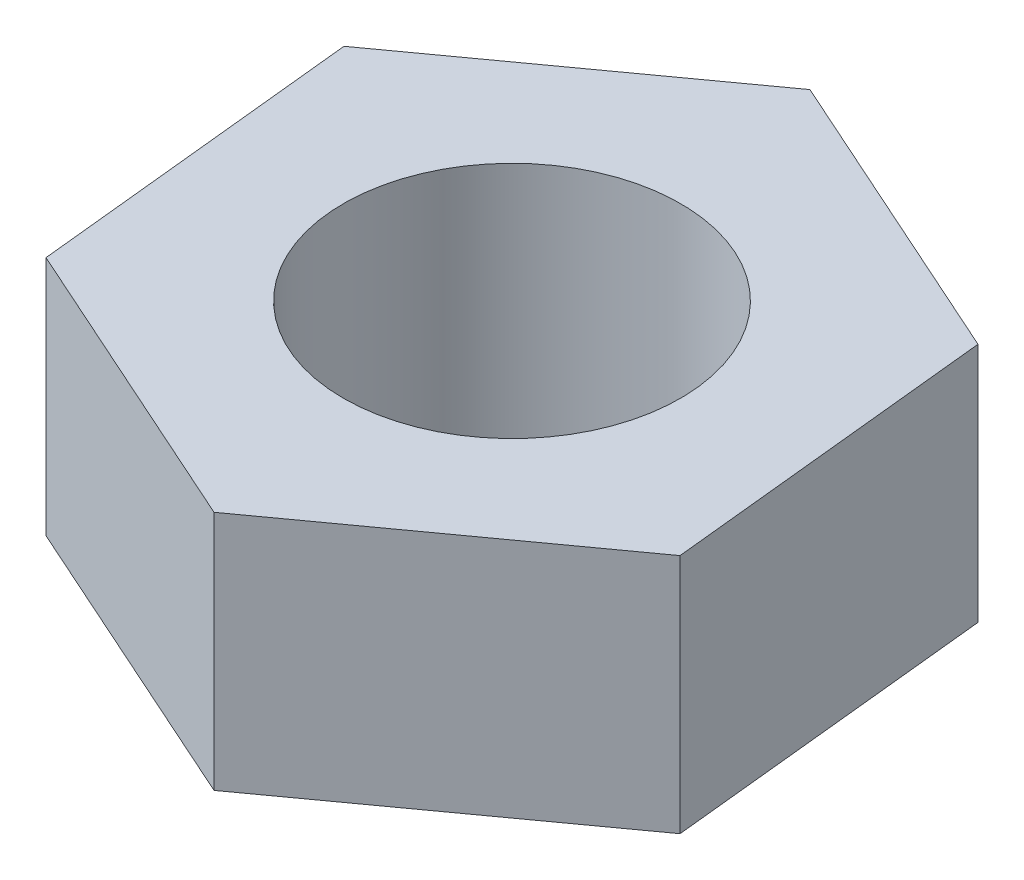
ISO-10303-21;
HEADER;
FILE_DESCRIPTION(('STEP AP214'),'2;1');
FILE_NAME('part.step','',(''),(''),'','','');
FILE_SCHEMA(('AUTOMOTIVE_DESIGN { 1 0 10303 214 1 1 1 1 }'));
ENDSEC;
DATA;
#1=APPLICATION_CONTEXT('core data for automotive mechanical design processes');
#2=APPLICATION_PROTOCOL_DEFINITION('international standard','automotive_design',2000,#1);
#3=PRODUCT_CONTEXT('',#1,'mechanical');
#4=PRODUCT('Part','Part','',(#3));
#5=PRODUCT_RELATED_PRODUCT_CATEGORY('part','',(#4));
#6=PRODUCT_DEFINITION_FORMATION('','',#4);
#7=PRODUCT_DEFINITION_CONTEXT('part definition',#1,'design');
#8=PRODUCT_DEFINITION('design','',#6,#7);
#9=PRODUCT_DEFINITION_SHAPE('','',#8);
#10=(LENGTH_UNIT() NAMED_UNIT(*) SI_UNIT(.MILLI.,.METRE.));
#11=(NAMED_UNIT(*) PLANE_ANGLE_UNIT() SI_UNIT($,.RADIAN.));
#12=(NAMED_UNIT(*) SI_UNIT($,.STERADIAN.) SOLID_ANGLE_UNIT());
#13=UNCERTAINTY_MEASURE_WITH_UNIT(LENGTH_MEASURE(1.E-05),#10,'distance_accuracy_value','');
#14=(GEOMETRIC_REPRESENTATION_CONTEXT(3) GLOBAL_UNCERTAINTY_ASSIGNED_CONTEXT((#13)) GLOBAL_UNIT_ASSIGNED_CONTEXT((#10,
#11,#12)) REPRESENTATION_CONTEXT('',''));
#15=CARTESIAN_POINT('',(0.,0.,0.));
#16=DIRECTION('',(0.,0.,1.));
#17=DIRECTION('',(1.,0.,0.));
#18=AXIS2_PLACEMENT_3D('',#15,#16,#17);
#19=CARTESIAN_POINT('',(7.21644966006352E-13,10.,2.46330733588707E-12));
#20=DIRECTION('',(0.,1.,0.));
#21=DIRECTION('',(0.,0.,1.00000000000003));
#22=AXIS2_PLACEMENT_3D('',#19,#20,#21);
#23=PLANE('',#22);
#24=DIRECTION('',(-0.102025444014476,0.,-0.994781789526572));
#25=VECTOR('',#24,1.);
#26=CARTESIAN_POINT('',(12.6442344851103,9.99999999999962,5.66774507944609));
#27=LINE('',#26,#25);
#28=CARTESIAN_POINT('',(12.6442344851103,9.99999999999962,5.66774507944609));
#29=VERTEX_POINT('',#28);
#30=CARTESIAN_POINT('',(11.2305284635279,9.99999999999959,-8.11635573578706));
#31=VERTEX_POINT('',#30);
#32=EDGE_CURVE('E144',#29,#31,#27,.T.);
#33=ORIENTED_EDGE('',*,*,#32,.T.);
#34=DIRECTION('',(-0.912519022959389,0.,-0.409034268414365));
#35=VECTOR('',#34,1.);
#36=CARTESIAN_POINT('',(11.2305284635279,9.99999999999959,-8.11635573578706));
#37=LINE('',#36,#35);
#38=CARTESIAN_POINT('',(-1.41370602158297,10.0000000000001,-13.7841008152311));
#39=VERTEX_POINT('',#38);
#40=EDGE_CURVE('E91',#31,#39,#37,.T.);
#41=ORIENTED_EDGE('',*,*,#40,.T.);
#42=DIRECTION('',(-0.810493578944917,0.,0.585747521112208));
#43=VECTOR('',#42,1.);
#44=CARTESIAN_POINT('',(-1.41370602158297,10.0000000000001,-13.7841008152311));
#45=LINE('',#44,#43);
#46=CARTESIAN_POINT('',(-12.6442344851105,9.99999999999916,-5.66774507944047));
#47=VERTEX_POINT('',#46);
#48=EDGE_CURVE('E104',#39,#47,#45,.T.);
#49=ORIENTED_EDGE('',*,*,#48,.T.);
#50=DIRECTION('',(0.102025444014476,0.,0.994781789526572));
#51=VECTOR('',#50,1.);
#52=CARTESIAN_POINT('',(-12.6442344851105,9.99999999999916,-5.66774507944047));
#53=LINE('',#52,#51);
#54=CARTESIAN_POINT('',(-11.230528463527,9.99999999999917,8.11635573579379));
#55=VERTEX_POINT('',#54);
#56=EDGE_CURVE('E98',#47,#55,#53,.T.);
#57=ORIENTED_EDGE('',*,*,#56,.T.);
#58=DIRECTION('',(0.912519022959389,0.,0.409034268414365));
#59=VECTOR('',#58,1.);
#60=CARTESIAN_POINT('',(-11.230528463527,9.99999999999917,8.11635573579379));
#61=LINE('',#60,#59);
#62=CARTESIAN_POINT('',(1.41370602158297,10.,13.7841008152369));
#63=VERTEX_POINT('',#62);
#64=EDGE_CURVE('E102',#55,#63,#61,.T.);
#65=ORIENTED_EDGE('',*,*,#64,.T.);
#66=DIRECTION('',(0.810493578944917,0.,-0.585747521112208));
#67=VECTOR('',#66,1.);
#68=CARTESIAN_POINT('',(1.41370602158297,10.,13.7841008152369));
#69=LINE('',#68,#67);
#70=EDGE_CURVE('E54',#63,#29,#69,.T.);
#71=ORIENTED_EDGE('',*,*,#70,.T.);
#72=EDGE_LOOP('',(#33,#41,#49,#57,#65,#71));
#73=FACE_BOUND('',#72,.T.);
#74=CARTESIAN_POINT('',(7.21644966006352E-13,10.,2.46330733588707E-12));
#75=DIRECTION('',(0.,1.,0.));
#76=DIRECTION('',(0.,0.,1.00000000000003));
#77=AXIS2_PLACEMENT_3D('',#74,#75,#76);
#78=CIRCLE('',#77,7.);
#79=CARTESIAN_POINT('',(7.19944936999894E-13,10.,7.00000000000265));
#80=VERTEX_POINT('',#79);
#81=EDGE_CURVE('E132',#80,#80,#78,.T.);
#82=ORIENTED_EDGE('',*,*,#81,.F.);
#83=EDGE_LOOP('',(#82));
#84=FACE_BOUND('',#83,.T.);
#85=ADVANCED_FACE('F36',(#73,#84),#23,.T.);
#86=CARTESIAN_POINT('',(0.,0.,0.));
#87=DIRECTION('',(0.,1.,0.));
#88=DIRECTION('',(0.,0.,1.00000000000003));
#89=AXIS2_PLACEMENT_3D('',#86,#87,#88);
#90=PLANE('',#89);
#91=DIRECTION('',(-0.102025444014476,0.,-0.994781789526572));
#92=VECTOR('',#91,1.);
#93=CARTESIAN_POINT('',(12.6442344851104,-4.37150315946155E-13,5.66774507944653));
#94=LINE('',#93,#92);
#95=CARTESIAN_POINT('',(12.6442344851104,-4.37150315946155E-13,5.66774507944653));
#96=VERTEX_POINT('',#95);
#97=CARTESIAN_POINT('',(11.2305284635275,-4.44089209850063E-13,-8.11635573578863));
#98=VERTEX_POINT('',#97);
#99=EDGE_CURVE('E127',#96,#98,#94,.T.);
#100=ORIENTED_EDGE('',*,*,#99,.F.);
#101=DIRECTION('',(0.810493578944917,0.,-0.585747521112208));
#102=VECTOR('',#101,1.);
#103=CARTESIAN_POINT('',(1.41370602158258,-2.18575157973078E-13,13.7841008152369));
#104=LINE('',#103,#102);
#105=CARTESIAN_POINT('',(1.41370602158258,-2.18575157973078E-13,13.7841008152369));
#106=VERTEX_POINT('',#105);
#107=EDGE_CURVE('E83',#106,#96,#104,.T.);
#108=ORIENTED_EDGE('',*,*,#107,.F.);
#109=DIRECTION('',(0.912519022959389,0.,0.409034268414365));
#110=VECTOR('',#109,1.);
#111=CARTESIAN_POINT('',(-11.2305284635281,-8.74300631892311E-13,8.11635573579422));
#112=LINE('',#111,#110);
#113=CARTESIAN_POINT('',(-11.2305284635281,-8.74300631892311E-13,8.11635573579422));
#114=VERTEX_POINT('',#113);
#115=EDGE_CURVE('E77',#114,#106,#112,.T.);
#116=ORIENTED_EDGE('',*,*,#115,.F.);
#117=DIRECTION('',(0.102025444014476,0.,0.994781789526572));
#118=VECTOR('',#117,1.);
#119=CARTESIAN_POINT('',(-12.6442344851108,-8.84708972748172E-13,-5.66774507944177));
#120=LINE('',#119,#118);
#121=CARTESIAN_POINT('',(-12.6442344851108,-8.84708972748172E-13,-5.66774507944177));
#122=VERTEX_POINT('',#121);
#123=EDGE_CURVE('E113',#122,#114,#120,.T.);
#124=ORIENTED_EDGE('',*,*,#123,.F.);
#125=DIRECTION('',(-0.810493578944917,0.,0.585747521112208));
#126=VECTOR('',#125,1.);
#127=CARTESIAN_POINT('',(-1.41370602158392,0.,-13.7841008152322));
#128=LINE('',#127,#126);
#129=CARTESIAN_POINT('',(-1.41370602158392,0.,-13.7841008152322));
#130=VERTEX_POINT('',#129);
#131=EDGE_CURVE('E135',#130,#122,#128,.T.);
#132=ORIENTED_EDGE('',*,*,#131,.F.);
#133=DIRECTION('',(-0.912519022959389,0.,-0.409034268414365));
#134=VECTOR('',#133,1.);
#135=CARTESIAN_POINT('',(11.2305284635275,-4.44089209850063E-13,-8.11635573578863));
#136=LINE('',#135,#134);
#137=EDGE_CURVE('E131',#98,#130,#136,.T.);
#138=ORIENTED_EDGE('',*,*,#137,.F.);
#139=EDGE_LOOP('',(#100,#108,#116,#124,#132,#138));
#140=FACE_BOUND('',#139,.T.);
#141=CARTESIAN_POINT('',(0.,0.,0.));
#142=DIRECTION('',(0.,1.,0.));
#143=DIRECTION('',(0.,0.,1.00000000000003));
#144=AXIS2_PLACEMENT_3D('',#141,#142,#143);
#145=CIRCLE('',#144,7.);
#146=CARTESIAN_POINT('',(0.,0.,7.00000000000019));
#147=VERTEX_POINT('',#146);
#148=EDGE_CURVE('E260',#147,#147,#145,.T.);
#149=ORIENTED_EDGE('',*,*,#148,.T.);
#150=EDGE_LOOP('',(#149));
#151=FACE_BOUND('',#150,.T.);
#152=ADVANCED_FACE('F158',(#140,#151),#90,.F.);
#153=CARTESIAN_POINT('',(12.6442344851103,9.99999999999962,5.66774507944609));
#154=DIRECTION('',(-0.994781789526569,0.,0.102025444014475));
#155=DIRECTION('',(0.102025444014475,0.,0.994781789526572));
#156=AXIS2_PLACEMENT_3D('',#153,#154,#155);
#157=PLANE('',#156);
#158=ORIENTED_EDGE('',*,*,#99,.T.);
#159=DIRECTION('',(0.,-1.,0.));
#160=VECTOR('',#159,1.);
#161=CARTESIAN_POINT('',(11.2305284635279,9.99999999999959,-8.11635573578706));
#162=LINE('',#161,#160);
#163=EDGE_CURVE('E11',#31,#98,#162,.T.);
#164=ORIENTED_EDGE('',*,*,#163,.F.);
#165=ORIENTED_EDGE('',*,*,#32,.F.);
#166=DIRECTION('',(0.,-1.,0.));
#167=VECTOR('',#166,1.);
#168=CARTESIAN_POINT('',(12.6442344851103,9.99999999999962,5.66774507944609));
#169=LINE('',#168,#167);
#170=EDGE_CURVE('E123',#29,#96,#169,.T.);
#171=ORIENTED_EDGE('',*,*,#170,.T.);
#172=EDGE_LOOP('',(#158,#164,#165,#171));
#173=FACE_BOUND('',#172,.T.);
#174=ADVANCED_FACE('F38',(#173),#157,.F.);
#175=CARTESIAN_POINT('',(11.2305284635279,9.99999999999959,-8.11635573578706));
#176=DIRECTION('',(-0.409034268414364,0.,0.912519022959391));
#177=DIRECTION('',(0.912519022959389,0.,0.409034268414365));
#178=AXIS2_PLACEMENT_3D('',#175,#176,#177);
#179=PLANE('',#178);
#180=ORIENTED_EDGE('',*,*,#137,.T.);
#181=DIRECTION('',(0.,-1.,0.));
#182=VECTOR('',#181,1.);
#183=CARTESIAN_POINT('',(-1.41370602158297,10.0000000000001,-13.7841008152311));
#184=LINE('',#183,#182);
#185=EDGE_CURVE('E46',#39,#130,#184,.T.);
#186=ORIENTED_EDGE('',*,*,#185,.F.);
#187=ORIENTED_EDGE('',*,*,#40,.F.);
#188=ORIENTED_EDGE('',*,*,#163,.T.);
#189=EDGE_LOOP('',(#180,#186,#187,#188));
#190=FACE_BOUND('',#189,.T.);
#191=ADVANCED_FACE('F183',(#190),#179,.F.);
#192=CARTESIAN_POINT('',(-1.41370602158297,10.0000000000001,-13.7841008152311));
#193=DIRECTION('',(0.585747521112209,0.,0.81049357894492));
#194=DIRECTION('',(0.810493578944917,0.,-0.585747521112208));
#195=AXIS2_PLACEMENT_3D('',#192,#193,#194);
#196=PLANE('',#195);
#197=ORIENTED_EDGE('',*,*,#131,.T.);
#198=DIRECTION('',(0.,-1.,0.));
#199=VECTOR('',#198,1.);
#200=CARTESIAN_POINT('',(-12.6442344851105,9.99999999999916,-5.66774507944047));
#201=LINE('',#200,#199);
#202=EDGE_CURVE('E115',#47,#122,#201,.T.);
#203=ORIENTED_EDGE('',*,*,#202,.F.);
#204=ORIENTED_EDGE('',*,*,#48,.F.);
#205=ORIENTED_EDGE('',*,*,#185,.T.);
#206=EDGE_LOOP('',(#197,#203,#204,#205));
#207=FACE_BOUND('',#206,.T.);
#208=ADVANCED_FACE('F155',(#207),#196,.F.);
#209=CARTESIAN_POINT('',(-12.6442344851105,9.99999999999916,-5.66774507944047));
#210=DIRECTION('',(0.994781789526569,0.,-0.102025444014475));
#211=DIRECTION('',(-0.102025444014475,0.,-0.994781789526572));
#212=AXIS2_PLACEMENT_3D('',#209,#210,#211);
#213=PLANE('',#212);
#214=ORIENTED_EDGE('',*,*,#123,.T.);
#215=DIRECTION('',(0.,-1.,0.));
#216=VECTOR('',#215,1.);
#217=CARTESIAN_POINT('',(-11.230528463527,9.99999999999917,8.11635573579379));
#218=LINE('',#217,#216);
#219=EDGE_CURVE('E110',#55,#114,#218,.T.);
#220=ORIENTED_EDGE('',*,*,#219,.F.);
#221=ORIENTED_EDGE('',*,*,#56,.F.);
#222=ORIENTED_EDGE('',*,*,#202,.T.);
#223=EDGE_LOOP('',(#214,#220,#221,#222));
#224=FACE_BOUND('',#223,.T.);
#225=ADVANCED_FACE('F111',(#224),#213,.F.);
#226=CARTESIAN_POINT('',(-11.230528463527,9.99999999999917,8.11635573579379));
#227=DIRECTION('',(0.409034268414363,0.,-0.912519022959393));
#228=DIRECTION('',(-0.912519022959389,0.,-0.409034268414365));
#229=AXIS2_PLACEMENT_3D('',#226,#227,#228);
#230=PLANE('',#229);
#231=ORIENTED_EDGE('',*,*,#115,.T.);
#232=DIRECTION('',(0.,-1.,0.));
#233=VECTOR('',#232,1.);
#234=CARTESIAN_POINT('',(1.41370602158297,10.,13.7841008152369));
#235=LINE('',#234,#233);
#236=EDGE_CURVE('E116',#63,#106,#235,.T.);
#237=ORIENTED_EDGE('',*,*,#236,.F.);
#238=ORIENTED_EDGE('',*,*,#64,.F.);
#239=ORIENTED_EDGE('',*,*,#219,.T.);
#240=EDGE_LOOP('',(#231,#237,#238,#239));
#241=FACE_BOUND('',#240,.T.);
#242=ADVANCED_FACE('F118',(#241),#230,.F.);
#243=CARTESIAN_POINT('',(1.41370602158297,10.,13.7841008152369));
#244=DIRECTION('',(-0.585747521112208,0.,-0.810493578944919));
#245=DIRECTION('',(-0.810493578944917,0.,0.585747521112208));
#246=AXIS2_PLACEMENT_3D('',#243,#244,#245);
#247=PLANE('',#246);
#248=ORIENTED_EDGE('',*,*,#107,.T.);
#249=ORIENTED_EDGE('',*,*,#170,.F.);
#250=ORIENTED_EDGE('',*,*,#70,.F.);
#251=ORIENTED_EDGE('',*,*,#236,.T.);
#252=EDGE_LOOP('',(#248,#249,#250,#251));
#253=FACE_BOUND('',#252,.T.);
#254=ADVANCED_FACE('F163',(#253),#247,.F.);
#255=CARTESIAN_POINT('',(7.21644966006352E-13,10.,2.46330733588707E-12));
#256=DIRECTION('',(0.,-1.,0.));
#257=DIRECTION('',(0.,0.,-1.00000000000003));
#258=AXIS2_PLACEMENT_3D('',#255,#256,#257);
#259=CYLINDRICAL_SURFACE('',#258,7.);
#260=ORIENTED_EDGE('',*,*,#81,.T.);
#261=EDGE_LOOP('',(#260));
#262=FACE_BOUND('',#261,.T.);
#263=ORIENTED_EDGE('',*,*,#148,.F.);
#264=EDGE_LOOP('',(#263));
#265=FACE_BOUND('',#264,.T.);
#266=ADVANCED_FACE('F165',(#262,#265),#259,.F.);
#267=CLOSED_SHELL('',(#85,#152,#174,#191,#208,#225,#242,#254,#266));
#268=MANIFOLD_SOLID_BREP('B2',#267);
#269=ADVANCED_BREP_SHAPE_REPRESENTATION('',(#18,#268),#14);
#270=SHAPE_DEFINITION_REPRESENTATION(#9,#269);
ENDSEC;
END-ISO-10303-21;
